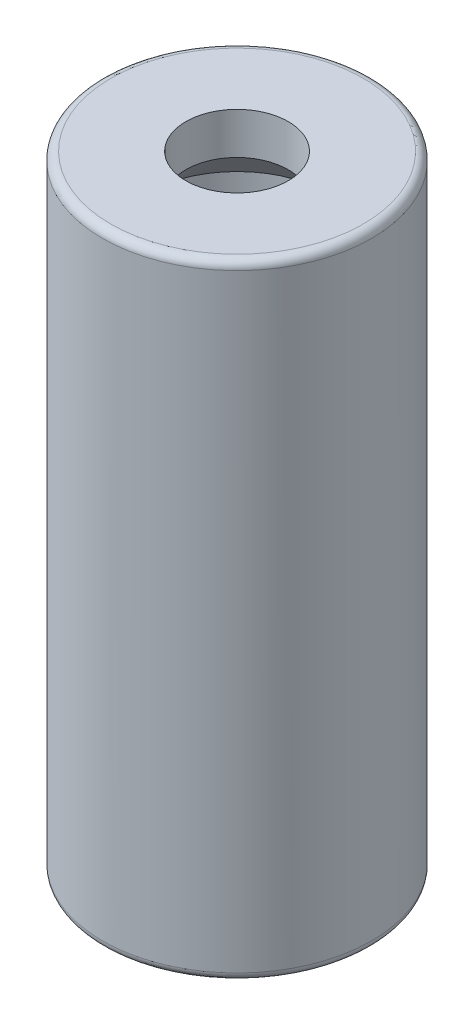
ISO-10303-21;
HEADER;
FILE_DESCRIPTION(('STEP AP214'),'2;1');
FILE_NAME('part.step','',(''),(''),'','','');
FILE_SCHEMA(('AUTOMOTIVE_DESIGN { 1 0 10303 214 1 1 1 1 }'));
ENDSEC;
DATA;
#1=APPLICATION_CONTEXT('core data for automotive mechanical design processes');
#2=APPLICATION_PROTOCOL_DEFINITION('international standard','automotive_design',2000,#1);
#3=PRODUCT_CONTEXT('',#1,'mechanical');
#4=PRODUCT('Part','Part','',(#3));
#5=PRODUCT_RELATED_PRODUCT_CATEGORY('part','',(#4));
#6=PRODUCT_DEFINITION_FORMATION('','',#4);
#7=PRODUCT_DEFINITION_CONTEXT('part definition',#1,'design');
#8=PRODUCT_DEFINITION('design','',#6,#7);
#9=PRODUCT_DEFINITION_SHAPE('','',#8);
#10=(LENGTH_UNIT() NAMED_UNIT(*) SI_UNIT(.MILLI.,.METRE.));
#11=(NAMED_UNIT(*) PLANE_ANGLE_UNIT() SI_UNIT($,.RADIAN.));
#12=(NAMED_UNIT(*) SI_UNIT($,.STERADIAN.) SOLID_ANGLE_UNIT());
#13=UNCERTAINTY_MEASURE_WITH_UNIT(LENGTH_MEASURE(1.E-05),#10,'distance_accuracy_value','');
#14=(GEOMETRIC_REPRESENTATION_CONTEXT(3) GLOBAL_UNCERTAINTY_ASSIGNED_CONTEXT((#13)) GLOBAL_UNIT_ASSIGNED_CONTEXT((#10,
#11,#12)) REPRESENTATION_CONTEXT('',''));
#15=CARTESIAN_POINT('',(0.,0.,0.));
#16=DIRECTION('',(0.,0.,1.));
#17=DIRECTION('',(1.,0.,0.));
#18=AXIS2_PLACEMENT_3D('',#15,#16,#17);
#19=CARTESIAN_POINT('',(0.,60.,0.));
#20=DIRECTION('',(0.,-1.,0.));
#21=DIRECTION('',(0.,0.,-1.));
#22=AXIS2_PLACEMENT_3D('',#19,#20,#21);
#23=CYLINDRICAL_SURFACE('',#22,16.15);
#24=CARTESIAN_POINT('',(0.,69.,0.));
#25=DIRECTION('',(0.,1.,0.));
#26=DIRECTION('',(0.,0.,1.));
#27=AXIS2_PLACEMENT_3D('',#24,#25,#26);
#28=CIRCLE('',#27,16.15);
#29=CARTESIAN_POINT('',(0.,69.,16.15));
#30=VERTEX_POINT('',#29);
#31=EDGE_CURVE('E38',#30,#30,#28,.F.);
#32=ORIENTED_EDGE('',*,*,#31,.T.);
#33=EDGE_LOOP('',(#32));
#34=FACE_BOUND('',#33,.T.);
#35=CARTESIAN_POINT('',(0.,-4.,0.));
#36=DIRECTION('',(0.,-1.,0.));
#37=DIRECTION('',(0.,0.,-1.));
#38=AXIS2_PLACEMENT_3D('',#35,#36,#37);
#39=CIRCLE('',#38,16.15);
#40=CARTESIAN_POINT('',(0.,-4.,-16.15));
#41=VERTEX_POINT('',#40);
#42=EDGE_CURVE('E42',#41,#41,#39,.F.);
#43=ORIENTED_EDGE('',*,*,#42,.T.);
#44=EDGE_LOOP('',(#43));
#45=FACE_BOUND('',#44,.T.);
#46=ADVANCED_FACE('F31',(#34,#45),#23,.T.);
#47=CARTESIAN_POINT('',(0.,-5.,0.));
#48=DIRECTION('',(0.,-1.,0.));
#49=DIRECTION('',(0.,0.,-1.));
#50=AXIS2_PLACEMENT_3D('',#47,#48,#49);
#51=PLANE('',#50);
#52=CARTESIAN_POINT('',(0.,-5.,0.));
#53=DIRECTION('',(0.,-1.,0.));
#54=DIRECTION('',(0.,0.,-1.));
#55=AXIS2_PLACEMENT_3D('',#52,#53,#54);
#56=CIRCLE('',#55,15.15);
#57=CARTESIAN_POINT('',(0.,-5.,-15.15));
#58=VERTEX_POINT('',#57);
#59=EDGE_CURVE('E10',#58,#58,#56,.T.);
#60=ORIENTED_EDGE('',*,*,#59,.T.);
#61=EDGE_LOOP('',(#60));
#62=FACE_BOUND('',#61,.T.);
#63=ADVANCED_FACE('F84',(#62),#51,.T.);
#64=CARTESIAN_POINT('',(0.,60.,0.));
#65=DIRECTION('',(0.,-1.,0.));
#66=DIRECTION('',(0.,0.,-1.));
#67=AXIS2_PLACEMENT_3D('',#64,#65,#66);
#68=CONICAL_SURFACE('',#67,11.15,0.785398163397449);
#69=CARTESIAN_POINT('',(0.,65.,0.));
#70=DIRECTION('',(0.,1.,0.));
#71=DIRECTION('',(0.,0.,1.));
#72=AXIS2_PLACEMENT_3D('',#69,#70,#71);
#73=CIRCLE('',#72,6.15);
#74=CARTESIAN_POINT('',(0.,65.,6.15));
#75=VERTEX_POINT('',#74);
#76=EDGE_CURVE('E57',#75,#75,#73,.T.);
#77=ORIENTED_EDGE('',*,*,#76,.T.);
#78=EDGE_LOOP('',(#77));
#79=FACE_BOUND('',#78,.T.);
#80=CARTESIAN_POINT('',(0.,60.,0.));
#81=DIRECTION('',(0.,1.,0.));
#82=DIRECTION('',(0.,0.,1.));
#83=AXIS2_PLACEMENT_3D('',#80,#81,#82);
#84=CIRCLE('',#83,11.15);
#85=CARTESIAN_POINT('',(0.,60.,11.15));
#86=VERTEX_POINT('',#85);
#87=EDGE_CURVE('E54',#86,#86,#84,.T.);
#88=ORIENTED_EDGE('',*,*,#87,.F.);
#89=EDGE_LOOP('',(#88));
#90=FACE_BOUND('',#89,.T.);
#91=ADVANCED_FACE('F81',(#79,#90),#68,.F.);
#92=CARTESIAN_POINT('',(0.,60.,0.));
#93=DIRECTION('',(0.,1.,0.));
#94=DIRECTION('',(0.,0.,1.));
#95=AXIS2_PLACEMENT_3D('',#92,#93,#94);
#96=CYLINDRICAL_SURFACE('',#95,6.15);
#97=CARTESIAN_POINT('',(0.,70.,0.));
#98=DIRECTION('',(0.,1.,0.));
#99=DIRECTION('',(0.,0.,1.));
#100=AXIS2_PLACEMENT_3D('',#97,#98,#99);
#101=CIRCLE('',#100,6.15);
#102=CARTESIAN_POINT('',(0.,70.,6.15));
#103=VERTEX_POINT('',#102);
#104=EDGE_CURVE('E60',#103,#103,#101,.T.);
#105=ORIENTED_EDGE('',*,*,#104,.T.);
#106=EDGE_LOOP('',(#105));
#107=FACE_BOUND('',#106,.T.);
#108=ORIENTED_EDGE('',*,*,#76,.F.);
#109=EDGE_LOOP('',(#108));
#110=FACE_BOUND('',#109,.T.);
#111=ADVANCED_FACE('F64',(#107,#110),#96,.F.);
#112=CARTESIAN_POINT('',(-6.15,70.,0.));
#113=DIRECTION('',(0.,1.,0.));
#114=DIRECTION('',(0.,0.,1.));
#115=AXIS2_PLACEMENT_3D('',#112,#113,#114);
#116=PLANE('',#115);
#117=CARTESIAN_POINT('',(0.,70.,0.));
#118=DIRECTION('',(0.,1.,0.));
#119=DIRECTION('',(0.,0.,1.));
#120=AXIS2_PLACEMENT_3D('',#117,#118,#119);
#121=CIRCLE('',#120,15.15);
#122=CARTESIAN_POINT('',(0.,70.,15.15));
#123=VERTEX_POINT('',#122);
#124=EDGE_CURVE('E46',#123,#123,#121,.T.);
#125=ORIENTED_EDGE('',*,*,#124,.T.);
#126=EDGE_LOOP('',(#125));
#127=FACE_BOUND('',#126,.T.);
#128=ORIENTED_EDGE('',*,*,#104,.F.);
#129=EDGE_LOOP('',(#128));
#130=FACE_BOUND('',#129,.T.);
#131=ADVANCED_FACE('F67',(#127,#130),#116,.T.);
#132=CARTESIAN_POINT('',(0.,0.,0.));
#133=DIRECTION('',(0.,-1.,0.));
#134=DIRECTION('',(0.,0.,-1.));
#135=AXIS2_PLACEMENT_3D('',#132,#133,#134);
#136=PLANE('',#135);
#137=CARTESIAN_POINT('',(0.,0.,0.));
#138=DIRECTION('',(0.,1.,0.));
#139=DIRECTION('',(0.,0.,1.));
#140=AXIS2_PLACEMENT_3D('',#137,#138,#139);
#141=CIRCLE('',#140,11.15);
#142=CARTESIAN_POINT('',(0.,0.,11.15));
#143=VERTEX_POINT('',#142);
#144=EDGE_CURVE('E51',#143,#143,#141,.T.);
#145=ORIENTED_EDGE('',*,*,#144,.T.);
#146=EDGE_LOOP('',(#145));
#147=FACE_BOUND('',#146,.T.);
#148=ADVANCED_FACE('F69',(#147),#136,.F.);
#149=CARTESIAN_POINT('',(0.,60.,0.));
#150=DIRECTION('',(0.,-1.,0.));
#151=DIRECTION('',(0.,0.,-1.));
#152=AXIS2_PLACEMENT_3D('',#149,#150,#151);
#153=CYLINDRICAL_SURFACE('',#152,11.15);
#154=ORIENTED_EDGE('',*,*,#87,.T.);
#155=EDGE_LOOP('',(#154));
#156=FACE_BOUND('',#155,.T.);
#157=ORIENTED_EDGE('',*,*,#144,.F.);
#158=EDGE_LOOP('',(#157));
#159=FACE_BOUND('',#158,.T.);
#160=ADVANCED_FACE('F77',(#156,#159),#153,.F.);
#161=CARTESIAN_POINT('',(0.,69.,0.));
#162=DIRECTION('',(0.,1.,0.));
#163=DIRECTION('',(0.,0.,1.));
#164=AXIS2_PLACEMENT_3D('',#161,#162,#163);
#165=TOROIDAL_SURFACE('',#164,15.15,1.);
#166=ORIENTED_EDGE('',*,*,#31,.F.);
#167=EDGE_LOOP('',(#166));
#168=FACE_BOUND('',#167,.T.);
#169=ORIENTED_EDGE('',*,*,#124,.F.);
#170=EDGE_LOOP('',(#169));
#171=FACE_BOUND('',#170,.T.);
#172=ADVANCED_FACE('F92',(#168,#171),#165,.T.);
#173=CARTESIAN_POINT('',(0.,-4.,0.));
#174=DIRECTION('',(0.,-1.,0.));
#175=DIRECTION('',(0.,0.,-1.));
#176=AXIS2_PLACEMENT_3D('',#173,#174,#175);
#177=TOROIDAL_SURFACE('',#176,15.15,1.);
#178=ORIENTED_EDGE('',*,*,#42,.F.);
#179=EDGE_LOOP('',(#178));
#180=FACE_BOUND('',#179,.T.);
#181=ORIENTED_EDGE('',*,*,#59,.F.);
#182=EDGE_LOOP('',(#181));
#183=FACE_BOUND('',#182,.T.);
#184=ADVANCED_FACE('F33',(#180,#183),#177,.T.);
#185=CLOSED_SHELL('',(#46,#63,#91,#111,#131,#148,#160,#172,#184));
#186=MANIFOLD_SOLID_BREP('B2',#185);
#187=ADVANCED_BREP_SHAPE_REPRESENTATION('',(#18,#186),#14);
#188=SHAPE_DEFINITION_REPRESENTATION(#9,#187);
ENDSEC;
END-ISO-10303-21;
